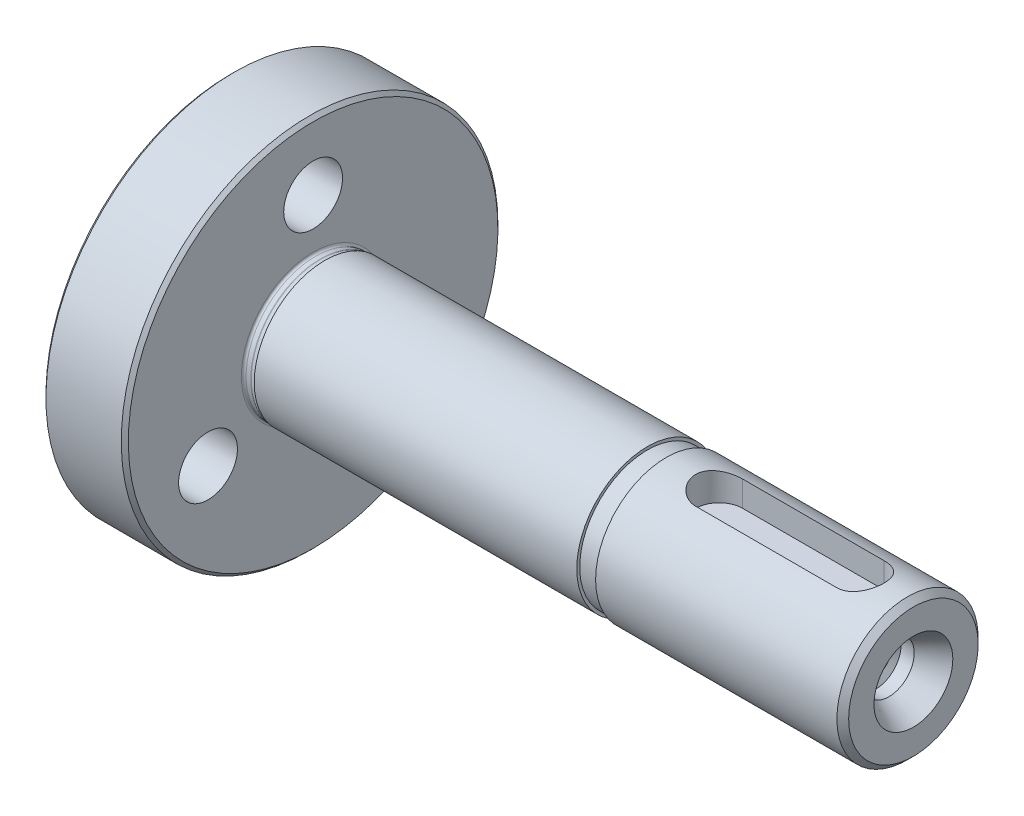
ISO-10303-21;
HEADER;
FILE_DESCRIPTION(('STEP AP214'),'2;1');
FILE_NAME('part.step','',(''),(''),'','','');
FILE_SCHEMA(('AUTOMOTIVE_DESIGN { 1 0 10303 214 1 1 1 1 }'));
ENDSEC;
DATA;
#1=APPLICATION_CONTEXT('core data for automotive mechanical design processes');
#2=APPLICATION_PROTOCOL_DEFINITION('international standard','automotive_design',2000,#1);
#3=PRODUCT_CONTEXT('',#1,'mechanical');
#4=PRODUCT('Part','Part','',(#3));
#5=PRODUCT_RELATED_PRODUCT_CATEGORY('part','',(#4));
#6=PRODUCT_DEFINITION_FORMATION('','',#4);
#7=PRODUCT_DEFINITION_CONTEXT('part definition',#1,'design');
#8=PRODUCT_DEFINITION('design','',#6,#7);
#9=PRODUCT_DEFINITION_SHAPE('','',#8);
#10=(LENGTH_UNIT() NAMED_UNIT(*) SI_UNIT(.MILLI.,.METRE.));
#11=(NAMED_UNIT(*) PLANE_ANGLE_UNIT() SI_UNIT($,.RADIAN.));
#12=(NAMED_UNIT(*) SI_UNIT($,.STERADIAN.) SOLID_ANGLE_UNIT());
#13=UNCERTAINTY_MEASURE_WITH_UNIT(LENGTH_MEASURE(1.E-05),#10,'distance_accuracy_value','');
#14=(GEOMETRIC_REPRESENTATION_CONTEXT(3) GLOBAL_UNCERTAINTY_ASSIGNED_CONTEXT((#13)) GLOBAL_UNIT_ASSIGNED_CONTEXT((#10,
#11,#12)) REPRESENTATION_CONTEXT('',''));
#15=CARTESIAN_POINT('',(0.,0.,0.));
#16=DIRECTION('',(0.,0.,1.));
#17=DIRECTION('',(1.,0.,0.));
#18=AXIS2_PLACEMENT_3D('',#15,#16,#17);
#19=CARTESIAN_POINT('',(37.0000000000346,0.,0.));
#20=DIRECTION('',(1.,0.,0.));
#21=DIRECTION('',(0.,0.,-1.));
#22=AXIS2_PLACEMENT_3D('',#19,#20,#21);
#23=CONICAL_SURFACE('',#22,1.64999999998372,1.02974425869627);
#24=CARTESIAN_POINT('',(36.0085799786987,0.,1.70530256582424E-10));
#25=VERTEX_POINT('',#24);
#26=VERTEX_LOOP('',#25);
#27=FACE_BOUND('',#26,.T.);
#28=CARTESIAN_POINT('',(37.,0.,0.));
#29=DIRECTION('',(1.,0.,0.));
#30=DIRECTION('',(0.,0.,-1.));
#31=AXIS2_PLACEMENT_3D('',#28,#29,#30);
#32=CIRCLE('',#31,1.65);
#33=CARTESIAN_POINT('',(37.,0.,-1.65));
#34=VERTEX_POINT('',#33);
#35=EDGE_CURVE('P0_E70',#34,#34,#32,.T.);
#36=ORIENTED_EDGE('',*,*,#35,.T.);
#37=EDGE_LOOP('',(#36));
#38=FACE_BOUND('',#37,.T.);
#39=ADVANCED_FACE('P0_F17',(#27,#38),#23,.F.);
#40=CARTESIAN_POINT('',(35.25900897753,0.,0.));
#41=DIRECTION('',(1.,0.,0.));
#42=DIRECTION('',(0.,0.,-1.));
#43=AXIS2_PLACEMENT_3D('',#40,#41,#42);
#44=CYLINDRICAL_SURFACE('',#43,1.65);
#45=ORIENTED_EDGE('',*,*,#35,.F.);
#46=EDGE_LOOP('',(#45));
#47=FACE_BOUND('',#46,.T.);
#48=CARTESIAN_POINT('',(47.4995696904443,0.,0.));
#49=DIRECTION('',(1.,0.,0.));
#50=DIRECTION('',(0.,0.,-1.));
#51=AXIS2_PLACEMENT_3D('',#48,#49,#50);
#52=CIRCLE('',#51,1.64999999992688);
#53=CARTESIAN_POINT('',(47.4995696904443,0.,-1.64999999992688));
#54=VERTEX_POINT('',#53);
#55=EDGE_CURVE('P0_E72',#54,#54,#52,.T.);
#56=ORIENTED_EDGE('',*,*,#55,.T.);
#57=EDGE_LOOP('',(#56));
#58=FACE_BOUND('',#57,.T.);
#59=ADVANCED_FACE('P0_F66',(#47,#58),#44,.F.);
#60=CARTESIAN_POINT('',(47.7999999998815,0.,0.));
#61=DIRECTION('',(1.,0.,0.));
#62=DIRECTION('',(0.,0.,-1.));
#63=AXIS2_PLACEMENT_3D('',#60,#61,#62);
#64=CONICAL_SURFACE('',#63,2.14999999974452,1.02974425864509);
#65=ORIENTED_EDGE('',*,*,#55,.F.);
#66=EDGE_LOOP('',(#65));
#67=FACE_BOUND('',#66,.T.);
#68=CARTESIAN_POINT('',(47.8,0.,0.));
#69=DIRECTION('',(1.,0.,0.));
#70=DIRECTION('',(0.,0.,-1.));
#71=AXIS2_PLACEMENT_3D('',#68,#69,#70);
#72=CIRCLE('',#71,2.15);
#73=CARTESIAN_POINT('',(47.8,0.,-2.15));
#74=VERTEX_POINT('',#73);
#75=EDGE_CURVE('P0_E75',#74,#74,#72,.T.);
#76=ORIENTED_EDGE('',*,*,#75,.T.);
#77=EDGE_LOOP('',(#76));
#78=FACE_BOUND('',#77,.T.);
#79=ADVANCED_FACE('P0_F283',(#67,#78),#64,.F.);
#80=CARTESIAN_POINT('',(46.28355715255,0.,0.));
#81=DIRECTION('',(1.,0.,0.));
#82=DIRECTION('',(0.,0.,-1.));
#83=AXIS2_PLACEMENT_3D('',#80,#81,#82);
#84=CYLINDRICAL_SURFACE('',#83,2.15);
#85=ORIENTED_EDGE('',*,*,#75,.F.);
#86=EDGE_LOOP('',(#85));
#87=FACE_BOUND('',#86,.T.);
#88=CARTESIAN_POINT('',(48.9215390309141,0.,0.));
#89=DIRECTION('',(1.,0.,0.));
#90=DIRECTION('',(0.,0.,-1.));
#91=AXIS2_PLACEMENT_3D('',#88,#89,#90);
#92=CIRCLE('',#91,2.15000000002874);
#93=CARTESIAN_POINT('',(48.9215390309141,0.,-2.15000000002874));
#94=VERTEX_POINT('',#93);
#95=EDGE_CURVE('P0_E278',#94,#94,#92,.T.);
#96=ORIENTED_EDGE('',*,*,#95,.T.);
#97=EDGE_LOOP('',(#96));
#98=FACE_BOUND('',#97,.T.);
#99=ADVANCED_FACE('P0_F285',(#87,#98),#84,.F.);
#100=CARTESIAN_POINT('',(51.0000000000446,0.,0.));
#101=DIRECTION('',(1.,0.,0.));
#102=DIRECTION('',(0.,0.,-1.));
#103=AXIS2_PLACEMENT_3D('',#100,#101,#102);
#104=CONICAL_SURFACE('',#103,3.35000000006858,0.523598775602716);
#105=ORIENTED_EDGE('',*,*,#95,.F.);
#106=EDGE_LOOP('',(#105));
#107=FACE_BOUND('',#106,.T.);
#108=CARTESIAN_POINT('',(50.9999999999877,0.,0.));
#109=DIRECTION('',(1.,0.,0.));
#110=DIRECTION('',(0.,0.,-1.));
#111=AXIS2_PLACEMENT_3D('',#108,#109,#110);
#112=CIRCLE('',#111,3.35000000003576);
#113=CARTESIAN_POINT('',(50.9999999999877,0.,-3.35000000003576));
#114=VERTEX_POINT('',#113);
#115=EDGE_CURVE('P0_E21',#114,#114,#112,.F.);
#116=ORIENTED_EDGE('',*,*,#115,.F.);
#117=EDGE_LOOP('',(#116));
#118=FACE_BOUND('',#117,.T.);
#119=ADVANCED_FACE('P0_F288',(#107,#118),#104,.F.);
#120=CARTESIAN_POINT('',(0.,3.5,0.));
#121=DIRECTION('',(0.,1.,0.));
#122=DIRECTION('',(0.,0.,1.));
#123=AXIS2_PLACEMENT_3D('',#120,#121,#122);
#124=PLANE('',#123);
#125=DIRECTION('',(1.,0.,0.));
#126=VECTOR('',#125,1.);
#127=CARTESIAN_POINT('',(34.5,3.5,2.));
#128=LINE('',#127,#126);
#129=CARTESIAN_POINT('',(34.5,3.5,2.));
#130=VERTEX_POINT('',#129);
#131=CARTESIAN_POINT('',(46.5,3.5,2.));
#132=VERTEX_POINT('',#131);
#133=EDGE_CURVE('P0_E58',#130,#132,#128,.T.);
#134=ORIENTED_EDGE('',*,*,#133,.T.);
#135=CARTESIAN_POINT('',(46.5,3.5,0.));
#136=DIRECTION('',(0.,1.,0.));
#137=DIRECTION('',(0.,0.,1.));
#138=AXIS2_PLACEMENT_3D('',#135,#136,#137);
#139=CIRCLE('',#138,2.);
#140=CARTESIAN_POINT('',(46.5,3.5,-2.));
#141=VERTEX_POINT('',#140);
#142=EDGE_CURVE('P0_E60',#132,#141,#139,.T.);
#143=ORIENTED_EDGE('',*,*,#142,.T.);
#144=DIRECTION('',(-1.,0.,0.));
#145=VECTOR('',#144,1.);
#146=CARTESIAN_POINT('',(46.5,3.5,-2.));
#147=LINE('',#146,#145);
#148=CARTESIAN_POINT('',(34.5,3.5,-2.));
#149=VERTEX_POINT('',#148);
#150=EDGE_CURVE('P0_E276',#141,#149,#147,.T.);
#151=ORIENTED_EDGE('',*,*,#150,.T.);
#152=CARTESIAN_POINT('',(34.5,3.5,0.));
#153=DIRECTION('',(0.,1.,0.));
#154=DIRECTION('',(0.,0.,1.));
#155=AXIS2_PLACEMENT_3D('',#152,#153,#154);
#156=CIRCLE('',#155,2.);
#157=EDGE_CURVE('P0_E267',#149,#130,#156,.T.);
#158=ORIENTED_EDGE('',*,*,#157,.T.);
#159=EDGE_LOOP('',(#134,#143,#151,#158));
#160=FACE_BOUND('',#159,.T.);
#161=ADVANCED_FACE('P0_F294',(#160),#124,.T.);
#162=CARTESIAN_POINT('',(51.,0.,0.));
#163=DIRECTION('',(1.,0.,0.));
#164=DIRECTION('',(0.,0.,-1.));
#165=AXIS2_PLACEMENT_3D('',#162,#163,#164);
#166=PLANE('',#165);
#167=CARTESIAN_POINT('',(50.9999999999877,0.,0.));
#168=DIRECTION('',(-1.,0.,0.));
#169=DIRECTION('',(0.,0.,1.));
#170=AXIS2_PLACEMENT_3D('',#167,#168,#169);
#171=CIRCLE('',#170,5.49999999998363);
#172=CARTESIAN_POINT('',(50.9999999999877,0.,5.49999999998363));
#173=VERTEX_POINT('',#172);
#174=EDGE_CURVE('P0_E263',#173,#173,#171,.T.);
#175=ORIENTED_EDGE('',*,*,#174,.F.);
#176=EDGE_LOOP('',(#175));
#177=FACE_BOUND('',#176,.T.);
#178=ORIENTED_EDGE('',*,*,#115,.T.);
#179=EDGE_LOOP('',(#178));
#180=FACE_BOUND('',#179,.T.);
#181=ADVANCED_FACE('P0_F299',(#177,#180),#166,.T.);
#182=CARTESIAN_POINT('',(46.5,6.1,-2.));
#183=DIRECTION('',(0.,0.,-1.));
#184=DIRECTION('',(-1.,0.,0.));
#185=AXIS2_PLACEMENT_3D('',#182,#183,#184);
#186=PLANE('',#185);
#187=DIRECTION('',(-1.,0.,0.));
#188=VECTOR('',#187,1.);
#189=CARTESIAN_POINT('',(131.4378642203,5.65685424949236,-2.00000000000006));
#190=LINE('',#189,#188);
#191=CARTESIAN_POINT('',(34.5,5.65685424949237,-2.00000000000003));
#192=VERTEX_POINT('',#191);
#193=CARTESIAN_POINT('',(46.5,5.65685424949237,-2.00000000000001));
#194=VERTEX_POINT('',#193);
#195=EDGE_CURVE('P0_E258',#192,#194,#190,.F.);
#196=ORIENTED_EDGE('',*,*,#195,.F.);
#197=DIRECTION('',(0.,1.,0.));
#198=VECTOR('',#197,1.);
#199=CARTESIAN_POINT('',(34.5,6.1,-2.));
#200=LINE('',#199,#198);
#201=EDGE_CURVE('P0_E268',#192,#149,#200,.F.);
#202=ORIENTED_EDGE('',*,*,#201,.T.);
#203=ORIENTED_EDGE('',*,*,#150,.F.);
#204=DIRECTION('',(0.,1.,0.));
#205=VECTOR('',#204,1.);
#206=CARTESIAN_POINT('',(46.5,6.1,-2.));
#207=LINE('',#206,#205);
#208=EDGE_CURVE('P0_E273',#141,#194,#207,.T.);
#209=ORIENTED_EDGE('',*,*,#208,.T.);
#210=EDGE_LOOP('',(#196,#202,#203,#209));
#211=FACE_BOUND('',#210,.T.);
#212=ADVANCED_FACE('P0_F301',(#211),#186,.F.);
#213=CARTESIAN_POINT('',(46.5,6.1,0.));
#214=DIRECTION('',(0.,1.,0.));
#215=DIRECTION('',(0.,0.,1.));
#216=AXIS2_PLACEMENT_3D('',#213,#214,#215);
#217=CYLINDRICAL_SURFACE('',#216,2.);
#218=ORIENTED_EDGE('',*,*,#208,.F.);
#219=ORIENTED_EDGE('',*,*,#142,.F.);
#220=DIRECTION('',(0.,1.,0.));
#221=VECTOR('',#220,1.);
#222=CARTESIAN_POINT('',(46.5,6.1,2.));
#223=LINE('',#222,#221);
#224=CARTESIAN_POINT('',(46.5,5.65685424949237,2.00000000000003));
#225=VERTEX_POINT('',#224);
#226=EDGE_CURVE('P0_E271',#132,#225,#223,.T.);
#227=ORIENTED_EDGE('',*,*,#226,.T.);
#228=CARTESIAN_POINT('',(46.5,5.65685424949238,-2.));
#229=CARTESIAN_POINT('',(46.5545809936022,5.65684884188678,-2.0000014949184));
#230=CARTESIAN_POINT('',(46.6091341243787,5.6576451988649,-1.99776424917478));
#231=CARTESIAN_POINT('',(46.7178171681098,5.66078654578442,-1.9888512140728));
#232=CARTESIAN_POINT('',(46.7719471913194,5.66313111768244,-1.98217662286705));
#233=CARTESIAN_POINT('',(46.9327842863903,5.67238184449301,-1.95562135046158));
#234=CARTESIAN_POINT('',(47.038361692541,5.6815058499903,-1.92920846605623));
#235=CARTESIAN_POINT('',(47.2432503848876,5.70456149397718,-1.85991682366086));
#236=CARTESIAN_POINT('',(47.3425650937458,5.71849047905858,-1.81704715197507));
#237=CARTESIAN_POINT('',(47.5326796680109,5.74957574438921,-1.71614645792974));
#238=CARTESIAN_POINT('',(47.6234742581347,5.76673400456216,-1.65810612564547));
#239=CARTESIAN_POINT('',(47.7974404626491,5.80308960804095,-1.52610278704603));
#240=CARTESIAN_POINT('',(47.8802297609252,5.82233755536618,-1.45164996064408));
#241=CARTESIAN_POINT('',(48.0324120355834,5.86027697385956,-1.28997688598297));
#242=CARTESIAN_POINT('',(48.1018026265119,5.87896834543705,-1.20275436910908));
#243=CARTESIAN_POINT('',(48.2269590376084,5.91427765988454,-1.01520729191253));
#244=CARTESIAN_POINT('',(48.2823219688045,5.93082875123708,-0.914600178716998));
#245=CARTESIAN_POINT('',(48.3751845033745,5.95939217209316,-0.704858499931723));
#246=CARTESIAN_POINT('',(48.4126895636409,5.97140588786619,-0.595726551186845));
#247=CARTESIAN_POINT('',(48.4674714521827,5.98918142285845,-0.376058690956079));
#248=CARTESIAN_POINT('',(48.4854065451074,5.99514617977147,-0.265703668920229));
#249=CARTESIAN_POINT('',(48.5026325970512,6.00087216807634,-0.04339793891135));
#250=CARTESIAN_POINT('',(48.5019279985395,6.00063487762605,0.0685523824907814));
#251=CARTESIAN_POINT('',(48.4823114337867,5.99412077270532,0.286207690558781));
#252=CARTESIAN_POINT('',(48.4641147240811,5.98808121982527,0.391985405251069));
#253=CARTESIAN_POINT('',(48.4112136026518,5.97093921001647,0.598888128753308));
#254=CARTESIAN_POINT('',(48.3765082755875,5.95983647235462,0.700012879232924));
#255=CARTESIAN_POINT('',(48.2911572607987,5.93351336542608,0.896305246061921));
#256=CARTESIAN_POINT('',(48.2403079097553,5.91824075676625,0.991377011307981));
#257=CARTESIAN_POINT('',(48.1242800972186,5.88516775360088,1.17184917819497));
#258=CARTESIAN_POINT('',(48.059097737907,5.86736667195186,1.25724693942937));
#259=CARTESIAN_POINT('',(47.9126579000063,5.83012543885479,1.42019467942242));
#260=CARTESIAN_POINT('',(47.8307889127806,5.81064757359828,1.49718722322539));
#261=CARTESIAN_POINT('',(47.6551170205677,5.77294980945702,1.63654404964076));
#262=CARTESIAN_POINT('',(47.5613102751935,5.75473031831506,1.69890360636762));
#263=CARTESIAN_POINT('',(47.3626396432934,5.72140062752635,1.80800665118557));
#264=CARTESIAN_POINT('',(47.2576329701341,5.70634029896469,1.85450601901537));
#265=CARTESIAN_POINT('',(47.0407060448201,5.68162194124078,1.92892046140223));
#266=CARTESIAN_POINT('',(46.9287970132557,5.67195538817985,1.95686487211071));
#267=CARTESIAN_POINT('',(46.763162726504,5.6627308418944,1.98331631256166));
#268=CARTESIAN_POINT('',(46.7107172202915,5.66053335389204,1.98957012251023));
#269=CARTESIAN_POINT('',(46.6055238432004,5.65759407142798,1.99790923214239));
#270=CARTESIAN_POINT('',(46.5527764509112,5.65685039859056,1.99999991078996));
#271=CARTESIAN_POINT('',(46.5,5.65685424949238,2.));
#272=B_SPLINE_CURVE_WITH_KNOTS('',3,(#228,#229,#230,#231,#232,#233,#234,#235,#236,#237,#238,
#239,#240,#241,#242,#243,#244,#245,#246,#247,#248,#249,#250,#251,#252,#253,#254,#255,#256,#257,
#258,#259,#260,#261,#262,#263,#264,#265,#266,#267,#268,#269,#270,#271),.UNSPECIFIED.,.F.,.F.,(4,
2,2,2,2,2,2,2,2,2,2,2,2,2,2,2,2,2,2,2,2,4),(0.,0.163636969470867,0.327229772338919,
0.653162396790742,0.978915321932481,1.30486862627062,1.64233009925355,1.97985159727494,
2.32618265866202,2.67240782242254,3.00658941454805,3.34069136061284,3.6616883693147,
3.98270317816496,4.30794037651935,4.63326613177537,4.973881081161,5.31460588498484,
5.6603605985608,6.00556734973678,6.16399790665502,6.32222363058113),.UNSPECIFIED.);
#273=EDGE_CURVE('P0_E134',#194,#225,#272,.T.);
#274=ORIENTED_EDGE('',*,*,#273,.F.);
#275=EDGE_LOOP('',(#218,#219,#227,#274));
#276=FACE_BOUND('',#275,.T.);
#277=ADVANCED_FACE('P0_F308',(#276),#217,.F.);
#278=CARTESIAN_POINT('',(34.5,6.1,2.));
#279=DIRECTION('',(0.,0.,1.));
#280=DIRECTION('',(1.,0.,0.));
#281=AXIS2_PLACEMENT_3D('',#278,#279,#280);
#282=PLANE('',#281);
#283=ORIENTED_EDGE('',*,*,#133,.F.);
#284=DIRECTION('',(0.,1.,0.));
#285=VECTOR('',#284,1.);
#286=CARTESIAN_POINT('',(34.5,6.1,2.));
#287=LINE('',#286,#285);
#288=CARTESIAN_POINT('',(34.5,5.65685424949237,2.00000000000001));
#289=VERTEX_POINT('',#288);
#290=EDGE_CURVE('P0_E36',#130,#289,#287,.T.);
#291=ORIENTED_EDGE('',*,*,#290,.T.);
#292=DIRECTION('',(-1.,0.,0.));
#293=VECTOR('',#292,1.);
#294=CARTESIAN_POINT('',(131.4378642203,5.65685424949236,2.00000000000006));
#295=LINE('',#294,#293);
#296=EDGE_CURVE('P0_E133',#225,#289,#295,.T.);
#297=ORIENTED_EDGE('',*,*,#296,.F.);
#298=ORIENTED_EDGE('',*,*,#226,.F.);
#299=EDGE_LOOP('',(#283,#291,#297,#298));
#300=FACE_BOUND('',#299,.T.);
#301=ADVANCED_FACE('P0_F159',(#300),#282,.F.);
#302=CARTESIAN_POINT('',(34.5,6.1,0.));
#303=DIRECTION('',(0.,1.,0.));
#304=DIRECTION('',(0.,0.,1.));
#305=AXIS2_PLACEMENT_3D('',#302,#303,#304);
#306=CYLINDRICAL_SURFACE('',#305,2.);
#307=ORIENTED_EDGE('',*,*,#290,.F.);
#308=ORIENTED_EDGE('',*,*,#157,.F.);
#309=ORIENTED_EDGE('',*,*,#201,.F.);
#310=CARTESIAN_POINT('',(34.5,5.65685424949238,2.));
#311=CARTESIAN_POINT('',(34.4454190063978,5.65684884188678,2.0000014949184));
#312=CARTESIAN_POINT('',(34.3908658756213,5.6576451988649,1.99776424917478));
#313=CARTESIAN_POINT('',(34.2821828318902,5.66078654578442,1.9888512140728));
#314=CARTESIAN_POINT('',(34.2280528086806,5.66313111768244,1.98217662286705));
#315=CARTESIAN_POINT('',(34.0672157136097,5.67238184449301,1.95562135046158));
#316=CARTESIAN_POINT('',(33.961638307459,5.6815058499903,1.92920846605623));
#317=CARTESIAN_POINT('',(33.7567496151124,5.70456149397718,1.85991682366086));
#318=CARTESIAN_POINT('',(33.6574349062542,5.71849047905858,1.81704715197507));
#319=CARTESIAN_POINT('',(33.4673203319891,5.74957574438921,1.71614645792974));
#320=CARTESIAN_POINT('',(33.3765257418653,5.76673400456216,1.65810612564547));
#321=CARTESIAN_POINT('',(33.2025595373509,5.80308960804095,1.52610278704603));
#322=CARTESIAN_POINT('',(33.1197702390748,5.82233755536618,1.45164996064408));
#323=CARTESIAN_POINT('',(32.9675879644166,5.86027697385956,1.28997688598297));
#324=CARTESIAN_POINT('',(32.8981973734881,5.87896834543705,1.20275436910908));
#325=CARTESIAN_POINT('',(32.7730409623916,5.91427765988454,1.01520729191253));
#326=CARTESIAN_POINT('',(32.7176780311955,5.93082875123708,0.914600178716998));
#327=CARTESIAN_POINT('',(32.6248154966255,5.95939217209316,0.704858499931723));
#328=CARTESIAN_POINT('',(32.5873104363591,5.97140588786619,0.595726551186845));
#329=CARTESIAN_POINT('',(32.5325285478173,5.98918142285845,0.376058690956079));
#330=CARTESIAN_POINT('',(32.5145934548926,5.99514617977147,0.265703668920229));
#331=CARTESIAN_POINT('',(32.4973674029488,6.00087216807634,0.04339793891135));
#332=CARTESIAN_POINT('',(32.4980720014605,6.00063487762605,-0.0685523824907814));
#333=CARTESIAN_POINT('',(32.5176885662133,5.99412077270532,-0.286207690558781));
#334=CARTESIAN_POINT('',(32.5358852759189,5.98808121982527,-0.391985405251069));
#335=CARTESIAN_POINT('',(32.5887863973482,5.97093921001647,-0.598888128753308));
#336=CARTESIAN_POINT('',(32.6234917244125,5.95983647235462,-0.700012879232924));
#337=CARTESIAN_POINT('',(32.7088427392013,5.93351336542608,-0.896305246061921));
#338=CARTESIAN_POINT('',(32.7596920902447,5.91824075676625,-0.991377011307981));
#339=CARTESIAN_POINT('',(32.8757199027814,5.88516775360088,-1.17184917819497));
#340=CARTESIAN_POINT('',(32.940902262093,5.86736667195186,-1.25724693942937));
#341=CARTESIAN_POINT('',(33.0873420999937,5.83012543885479,-1.42019467942242));
#342=CARTESIAN_POINT('',(33.1692110872194,5.81064757359828,-1.49718722322539));
#343=CARTESIAN_POINT('',(33.3448829794323,5.77294980945702,-1.63654404964076));
#344=CARTESIAN_POINT('',(33.4386897248065,5.75473031831506,-1.69890360636762));
#345=CARTESIAN_POINT('',(33.6373603567066,5.72140062752635,-1.80800665118557));
#346=CARTESIAN_POINT('',(33.7423670298659,5.70634029896469,-1.85450601901537));
#347=CARTESIAN_POINT('',(33.9592939551799,5.68162194124078,-1.92892046140223));
#348=CARTESIAN_POINT('',(34.0712029867443,5.67195538817985,-1.95686487211071));
#349=CARTESIAN_POINT('',(34.236837273496,5.6627308418944,-1.98331631256166));
#350=CARTESIAN_POINT('',(34.2892827797085,5.66053335389204,-1.98957012251023));
#351=CARTESIAN_POINT('',(34.3944761567996,5.65759407142798,-1.99790923214239));
#352=CARTESIAN_POINT('',(34.4472235490888,5.65685039859056,-1.99999991078996));
#353=CARTESIAN_POINT('',(34.5,5.65685424949238,-2.));
#354=B_SPLINE_CURVE_WITH_KNOTS('',3,(#310,#311,#312,#313,#314,#315,#316,#317,#318,#319,#320,
#321,#322,#323,#324,#325,#326,#327,#328,#329,#330,#331,#332,#333,#334,#335,#336,#337,#338,#339,
#340,#341,#342,#343,#344,#345,#346,#347,#348,#349,#350,#351,#352,#353),.UNSPECIFIED.,.F.,.F.,(4,
2,2,2,2,2,2,2,2,2,2,2,2,2,2,2,2,2,2,2,2,4),(0.,0.163636969470867,0.327229772338919,
0.653162396790742,0.978915321932481,1.30486862627062,1.64233009925355,1.97985159727494,
2.32618265866202,2.67240782242254,3.00658941454805,3.34069136061284,3.6616883693147,
3.98270317816496,4.30794037651935,4.63326613177537,4.973881081161,5.31460588498484,
5.6603605985608,6.00556734973678,6.16399790665502,6.32222363058113),.UNSPECIFIED.);
#355=EDGE_CURVE('P0_E125',#289,#192,#354,.T.);
#356=ORIENTED_EDGE('',*,*,#355,.F.);
#357=EDGE_LOOP('',(#307,#308,#309,#356));
#358=FACE_BOUND('',#357,.T.);
#359=ADVANCED_FACE('P0_F140',(#358),#306,.F.);
#360=CARTESIAN_POINT('',(50.5000000000564,0.,0.));
#361=DIRECTION('',(-1.,0.,0.));
#362=DIRECTION('',(0.,0.,1.));
#363=AXIS2_PLACEMENT_3D('',#360,#361,#362);
#364=CONICAL_SURFACE('',#363,5.99999999997181,0.785398163454292);
#365=ORIENTED_EDGE('',*,*,#174,.T.);
#366=EDGE_LOOP('',(#365));
#367=FACE_BOUND('',#366,.T.);
#368=CARTESIAN_POINT('',(50.5,0.,0.));
#369=DIRECTION('',(-1.,0.,0.));
#370=DIRECTION('',(0.,0.,1.));
#371=AXIS2_PLACEMENT_3D('',#368,#369,#370);
#372=CIRCLE('',#371,6.);
#373=CARTESIAN_POINT('',(50.5,0.,6.));
#374=VERTEX_POINT('',#373);
#375=EDGE_CURVE('P0_E124',#374,#374,#372,.T.);
#376=ORIENTED_EDGE('',*,*,#375,.F.);
#377=EDGE_LOOP('',(#376));
#378=FACE_BOUND('',#377,.T.);
#379=ADVANCED_FACE('P0_F149',(#367,#378),#364,.T.);
#380=CARTESIAN_POINT('',(131.4378642203,0.,0.));
#381=DIRECTION('',(-1.,0.,0.));
#382=DIRECTION('',(0.,0.,1.));
#383=AXIS2_PLACEMENT_3D('',#380,#381,#382);
#384=CYLINDRICAL_SURFACE('',#383,6.);
#385=ORIENTED_EDGE('',*,*,#375,.T.);
#386=EDGE_LOOP('',(#385));
#387=FACE_BOUND('',#386,.T.);
#388=CARTESIAN_POINT('',(30.,0.,0.));
#389=DIRECTION('',(-1.,0.,0.));
#390=DIRECTION('',(0.,0.,1.));
#391=AXIS2_PLACEMENT_3D('',#388,#389,#390);
#392=CIRCLE('',#391,6.);
#393=CARTESIAN_POINT('',(30.,0.,6.));
#394=VERTEX_POINT('',#393);
#395=EDGE_CURVE('P0_E121',#394,#394,#392,.F.);
#396=ORIENTED_EDGE('',*,*,#395,.T.);
#397=EDGE_LOOP('',(#396));
#398=FACE_BOUND('',#397,.T.);
#399=ORIENTED_EDGE('',*,*,#296,.T.);
#400=ORIENTED_EDGE('',*,*,#355,.T.);
#401=ORIENTED_EDGE('',*,*,#195,.T.);
#402=ORIENTED_EDGE('',*,*,#273,.T.);
#403=EDGE_LOOP('',(#399,#400,#401,#402));
#404=FACE_BOUND('',#403,.T.);
#405=ADVANCED_FACE('P0_F144',(#387,#398,#404),#384,.T.);
#406=CARTESIAN_POINT('',(30.,0.,0.));
#407=DIRECTION('',(1.,0.,0.));
#408=DIRECTION('',(0.,0.,-1.));
#409=AXIS2_PLACEMENT_3D('',#406,#407,#408);
#410=PLANE('',#409);
#411=ORIENTED_EDGE('',*,*,#395,.F.);
#412=EDGE_LOOP('',(#411));
#413=FACE_BOUND('',#412,.T.);
#414=CARTESIAN_POINT('',(30.,0.,0.));
#415=DIRECTION('',(1.,0.,0.));
#416=DIRECTION('',(0.,0.,-1.));
#417=AXIS2_PLACEMENT_3D('',#414,#415,#416);
#418=CIRCLE('',#417,5.75);
#419=CARTESIAN_POINT('',(30.,0.,-5.75));
#420=VERTEX_POINT('',#419);
#421=EDGE_CURVE('P0_E118',#420,#420,#418,.F.);
#422=ORIENTED_EDGE('',*,*,#421,.F.);
#423=EDGE_LOOP('',(#422));
#424=FACE_BOUND('',#423,.T.);
#425=ADVANCED_FACE('P0_F148',(#413,#424),#410,.F.);
#426=CARTESIAN_POINT('',(-9.9,0.,0.));
#427=DIRECTION('',(1.,0.,0.));
#428=DIRECTION('',(0.,0.,-1.));
#429=AXIS2_PLACEMENT_3D('',#426,#427,#428);
#430=CYLINDRICAL_SURFACE('',#429,5.75);
#431=ORIENTED_EDGE('',*,*,#421,.T.);
#432=EDGE_LOOP('',(#431));
#433=FACE_BOUND('',#432,.T.);
#434=CARTESIAN_POINT('',(28.4,0.,0.));
#435=DIRECTION('',(1.,0.,0.));
#436=DIRECTION('',(0.,0.,-1.));
#437=AXIS2_PLACEMENT_3D('',#434,#435,#436);
#438=CIRCLE('',#437,5.75);
#439=CARTESIAN_POINT('',(28.4,0.,-5.75));
#440=VERTEX_POINT('',#439);
#441=EDGE_CURVE('P0_E115',#440,#440,#438,.F.);
#442=ORIENTED_EDGE('',*,*,#441,.F.);
#443=EDGE_LOOP('',(#442));
#444=FACE_BOUND('',#443,.T.);
#445=ADVANCED_FACE('P0_F234',(#433,#444),#430,.T.);
#446=CARTESIAN_POINT('',(28.4,0.,0.));
#447=DIRECTION('',(1.,0.,0.));
#448=DIRECTION('',(0.,0.,-1.));
#449=AXIS2_PLACEMENT_3D('',#446,#447,#448);
#450=PLANE('',#449);
#451=CARTESIAN_POINT('',(28.4,0.,0.));
#452=DIRECTION('',(-1.,0.,0.));
#453=DIRECTION('',(0.,0.,1.));
#454=AXIS2_PLACEMENT_3D('',#451,#452,#453);
#455=CIRCLE('',#454,6.);
#456=CARTESIAN_POINT('',(28.4,0.,6.));
#457=VERTEX_POINT('',#456);
#458=EDGE_CURVE('P0_E112',#457,#457,#455,.T.);
#459=ORIENTED_EDGE('',*,*,#458,.F.);
#460=EDGE_LOOP('',(#459));
#461=FACE_BOUND('',#460,.T.);
#462=ORIENTED_EDGE('',*,*,#441,.T.);
#463=EDGE_LOOP('',(#462));
#464=FACE_BOUND('',#463,.T.);
#465=ADVANCED_FACE('P0_F231',(#461,#464),#450,.T.);
#466=CARTESIAN_POINT('',(-6.,0.,0.));
#467=DIRECTION('',(1.,0.,0.));
#468=DIRECTION('',(0.,0.,-1.));
#469=AXIS2_PLACEMENT_3D('',#466,#467,#468);
#470=PLANE('',#469);
#471=CARTESIAN_POINT('',(-6.00000000002865,0.,0.));
#472=DIRECTION('',(-1.,0.,0.));
#473=DIRECTION('',(0.,0.,1.));
#474=AXIS2_PLACEMENT_3D('',#471,#472,#473);
#475=CIRCLE('',#474,6.35000000000643);
#476=CARTESIAN_POINT('',(-6.00000000002865,0.,6.35000000000643));
#477=VERTEX_POINT('',#476);
#478=EDGE_CURVE('P0_E109',#477,#477,#475,.T.);
#479=ORIENTED_EDGE('',*,*,#478,.T.);
#480=EDGE_LOOP('',(#479));
#481=FACE_BOUND('',#480,.T.);
#482=ADVANCED_FACE('P0_F227',(#481),#470,.F.);
#483=CARTESIAN_POINT('',(131.4378642203,0.,0.));
#484=DIRECTION('',(-1.,0.,0.));
#485=DIRECTION('',(0.,0.,1.));
#486=AXIS2_PLACEMENT_3D('',#483,#484,#485);
#487=CYLINDRICAL_SURFACE('',#486,6.);
#488=ORIENTED_EDGE('',*,*,#458,.T.);
#489=EDGE_LOOP('',(#488));
#490=FACE_BOUND('',#489,.T.);
#491=CARTESIAN_POINT('',(0.996794919217336,0.,0.));
#492=DIRECTION('',(1.,0.,0.));
#493=DIRECTION('',(0.,0.,-1.));
#494=AXIS2_PLACEMENT_3D('',#491,#492,#493);
#495=CIRCLE('',#494,6.00000000000023);
#496=CARTESIAN_POINT('',(0.996794919217336,0.,-6.00000000000023));
#497=VERTEX_POINT('',#496);
#498=EDGE_CURVE('P0_E108',#497,#497,#495,.F.);
#499=ORIENTED_EDGE('',*,*,#498,.F.);
#500=EDGE_LOOP('',(#499));
#501=FACE_BOUND('',#500,.T.);
#502=ADVANCED_FACE('P0_F223',(#490,#501),#487,.T.);
#503=CARTESIAN_POINT('',(-6.99999999989132,0.,0.));
#504=DIRECTION('',(-1.,0.,0.));
#505=DIRECTION('',(0.,0.,1.));
#506=AXIS2_PLACEMENT_3D('',#503,#504,#505);
#507=CONICAL_SURFACE('',#506,6.92735026910896,0.523598775592442);
#508=ORIENTED_EDGE('',*,*,#478,.F.);
#509=EDGE_LOOP('',(#508));
#510=FACE_BOUND('',#509,.T.);
#511=CARTESIAN_POINT('',(-7.000000000005,0.,0.));
#512=DIRECTION('',(-1.,0.,0.));
#513=DIRECTION('',(0.,0.,1.));
#514=AXIS2_PLACEMENT_3D('',#511,#512,#513);
#515=CIRCLE('',#514,6.92735026917459);
#516=CARTESIAN_POINT('',(-7.000000000005,0.,6.92735026917459));
#517=VERTEX_POINT('',#516);
#518=EDGE_CURVE('P0_E105',#517,#517,#515,.T.);
#519=ORIENTED_EDGE('',*,*,#518,.T.);
#520=EDGE_LOOP('',(#519));
#521=FACE_BOUND('',#520,.T.);
#522=ADVANCED_FACE('P0_F219',(#510,#521),#507,.F.);
#523=CARTESIAN_POINT('',(0.99679491910365,0.,0.));
#524=DIRECTION('',(1.,0.,0.));
#525=DIRECTION('',(0.,0.,-1.));
#526=AXIS2_PLACEMENT_3D('',#523,#524,#525);
#527=CONICAL_SURFACE('',#526,5.99999999997181,0.261799387749815);
#528=CARTESIAN_POINT('',(0.649023147988954,0.,0.));
#529=DIRECTION('',(1.,0.,0.));
#530=DIRECTION('',(0.,0.,-1.));
#531=AXIS2_PLACEMENT_3D('',#528,#529,#530);
#532=CIRCLE('',#531,5.90681483474217);
#533=CARTESIAN_POINT('',(0.649023147988954,0.,-5.90681483474217));
#534=VERTEX_POINT('',#533);
#535=EDGE_CURVE('P0_E104',#534,#534,#532,.T.);
#536=ORIENTED_EDGE('',*,*,#535,.T.);
#537=EDGE_LOOP('',(#536));
#538=FACE_BOUND('',#537,.T.);
#539=ORIENTED_EDGE('',*,*,#498,.T.);
#540=EDGE_LOOP('',(#539));
#541=FACE_BOUND('',#540,.T.);
#542=ADVANCED_FACE('P0_F215',(#538,#541),#527,.T.);
#543=CARTESIAN_POINT('',(-7.,0.,0.));
#544=DIRECTION('',(1.,0.,0.));
#545=DIRECTION('',(0.,0.,-1.));
#546=AXIS2_PLACEMENT_3D('',#543,#544,#545);
#547=PLANE('',#546);
#548=CARTESIAN_POINT('',(-6.99999999999803,0.,0.));
#549=DIRECTION('',(1.,0.,0.));
#550=DIRECTION('',(0.,1.,0.));
#551=AXIS2_PLACEMENT_3D('',#548,#549,#550);
#552=CIRCLE('',#551,15.699999999998);
#553=CARTESIAN_POINT('',(-6.99999999999803,15.699999999998,0.));
#554=VERTEX_POINT('',#553);
#555=EDGE_CURVE('P0_E101',#554,#554,#552,.T.);
#556=ORIENTED_EDGE('',*,*,#555,.F.);
#557=EDGE_LOOP('',(#556));
#558=FACE_BOUND('',#557,.T.);
#559=ORIENTED_EDGE('',*,*,#518,.F.);
#560=EDGE_LOOP('',(#559));
#561=FACE_BOUND('',#560,.T.);
#562=CARTESIAN_POINT('',(-7.00000000006185,10.313,0.));
#563=DIRECTION('',(-1.,0.,0.));
#564=DIRECTION('',(0.,0.,1.));
#565=AXIS2_PLACEMENT_3D('',#562,#563,#564);
#566=CIRCLE('',#565,2.67320508072544);
#567=CARTESIAN_POINT('',(-7.00000000006185,10.313,2.67320508072544));
#568=VERTEX_POINT('',#567);
#569=EDGE_CURVE('P0_E91',#568,#568,#566,.F.);
#570=ORIENTED_EDGE('',*,*,#569,.T.);
#571=EDGE_LOOP('',(#570));
#572=FACE_BOUND('',#571,.T.);
#573=CARTESIAN_POINT('',(-7.000000000005,-5.1565,-8.931319989229));
#574=DIRECTION('',(-1.,0.,0.));
#575=DIRECTION('',(0.,0.,1.));
#576=AXIS2_PLACEMENT_3D('',#573,#574,#575);
#577=CIRCLE('',#576,2.67320508070998);
#578=CARTESIAN_POINT('',(-7.000000000005,-5.1565,-6.25811490851902));
#579=VERTEX_POINT('',#578);
#580=EDGE_CURVE('P0_E98',#579,#579,#577,.F.);
#581=ORIENTED_EDGE('',*,*,#580,.T.);
#582=EDGE_LOOP('',(#581));
#583=FACE_BOUND('',#582,.T.);
#584=CARTESIAN_POINT('',(-6.99999999994816,-5.1565,8.931319989229));
#585=DIRECTION('',(-1.,0.,0.));
#586=DIRECTION('',(0.,0.,1.));
#587=AXIS2_PLACEMENT_3D('',#584,#585,#586);
#588=CIRCLE('',#587,2.67320508074969);
#589=CARTESIAN_POINT('',(-6.99999999994816,-5.1565,11.6045250699787));
#590=VERTEX_POINT('',#589);
#591=EDGE_CURVE('P0_E95',#590,#590,#588,.F.);
#592=ORIENTED_EDGE('',*,*,#591,.T.);
#593=EDGE_LOOP('',(#592));
#594=FACE_BOUND('',#593,.T.);
#595=ADVANCED_FACE('P0_F212',(#558,#561,#572,#583,#594),#547,.F.);
#596=CARTESIAN_POINT('',(0.5972593389685,0.,0.));
#597=DIRECTION('',(1.,0.,0.));
#598=DIRECTION('',(0.,0.,-1.));
#599=AXIS2_PLACEMENT_3D('',#596,#597,#598);
#600=TOROIDAL_SURFACE('',#599,6.10000000000005,0.20000000000005);
#601=CARTESIAN_POINT('',(0.5972593389685,0.,0.));
#602=DIRECTION('',(1.,0.,0.));
#603=DIRECTION('',(0.,0.,-1.));
#604=AXIS2_PLACEMENT_3D('',#601,#602,#603);
#605=CIRCLE('',#604,5.9);
#606=CARTESIAN_POINT('',(0.5972593389685,0.,-5.9));
#607=VERTEX_POINT('',#606);
#608=EDGE_CURVE('P0_E94',#607,#607,#605,.F.);
#609=ORIENTED_EDGE('',*,*,#608,.F.);
#610=EDGE_LOOP('',(#609));
#611=FACE_BOUND('',#610,.T.);
#612=ORIENTED_EDGE('',*,*,#535,.F.);
#613=EDGE_LOOP('',(#612));
#614=FACE_BOUND('',#613,.T.);
#615=ADVANCED_FACE('P0_F210',(#611,#614),#600,.F.);
#616=CARTESIAN_POINT('',(-6.7,0.,0.));
#617=DIRECTION('',(1.,0.,0.));
#618=DIRECTION('',(0.,1.,0.));
#619=AXIS2_PLACEMENT_3D('',#616,#617,#618);
#620=CONICAL_SURFACE('',#619,15.999999999996,0.785398163397299);
#621=ORIENTED_EDGE('',*,*,#555,.T.);
#622=EDGE_LOOP('',(#621));
#623=FACE_BOUND('',#622,.T.);
#624=CARTESIAN_POINT('',(-6.7,0.,0.));
#625=DIRECTION('',(1.,0.,0.));
#626=DIRECTION('',(0.,0.,-1.));
#627=AXIS2_PLACEMENT_3D('',#624,#625,#626);
#628=CIRCLE('',#627,16.);
#629=CARTESIAN_POINT('',(-6.7,0.,-16.));
#630=VERTEX_POINT('',#629);
#631=EDGE_CURVE('P0_E329',#630,#630,#628,.T.);
#632=ORIENTED_EDGE('',*,*,#631,.F.);
#633=EDGE_LOOP('',(#632));
#634=FACE_BOUND('',#633,.T.);
#635=ADVANCED_FACE('P0_F206',(#623,#634),#620,.T.);
#636=CARTESIAN_POINT('',(-7.000000000005,-5.1565,-8.931319989229));
#637=DIRECTION('',(-1.,0.,0.));
#638=DIRECTION('',(0.,0.,1.));
#639=AXIS2_PLACEMENT_3D('',#636,#637,#638);
#640=CONICAL_SURFACE('',#639,2.67320508070998,0.523598775634054);
#641=ORIENTED_EDGE('',*,*,#580,.F.);
#642=EDGE_LOOP('',(#641));
#643=FACE_BOUND('',#642,.T.);
#644=CARTESIAN_POINT('',(-6.7,-5.1565,-8.931319989229));
#645=DIRECTION('',(-1.,0.,0.));
#646=DIRECTION('',(0.,0.,1.));
#647=AXIS2_PLACEMENT_3D('',#644,#645,#646);
#648=CIRCLE('',#647,2.5);
#649=CARTESIAN_POINT('',(-6.7,-5.1565,-6.431319989229));
#650=VERTEX_POINT('',#649);
#651=EDGE_CURVE('P0_E332',#650,#650,#648,.F.);
#652=ORIENTED_EDGE('',*,*,#651,.T.);
#653=EDGE_LOOP('',(#652));
#654=FACE_BOUND('',#653,.T.);
#655=ADVANCED_FACE('P0_F202',(#643,#654),#640,.F.);
#656=CARTESIAN_POINT('',(-6.99999999983447,-5.1565,8.931319989229));
#657=DIRECTION('',(-1.,0.,0.));
#658=DIRECTION('',(0.,0.,1.));
#659=AXIS2_PLACEMENT_3D('',#656,#657,#658);
#660=CONICAL_SURFACE('',#659,2.67320508068405,0.523598775634054);
#661=ORIENTED_EDGE('',*,*,#591,.F.);
#662=EDGE_LOOP('',(#661));
#663=FACE_BOUND('',#662,.T.);
#664=CARTESIAN_POINT('',(-6.7,-5.1565,8.931319989229));
#665=DIRECTION('',(-1.,0.,0.));
#666=DIRECTION('',(0.,0.,1.));
#667=AXIS2_PLACEMENT_3D('',#664,#665,#666);
#668=CIRCLE('',#667,2.5);
#669=CARTESIAN_POINT('',(-6.7,-5.1565,11.431319989229));
#670=VERTEX_POINT('',#669);
#671=EDGE_CURVE('P0_E335',#670,#670,#668,.F.);
#672=ORIENTED_EDGE('',*,*,#671,.T.);
#673=EDGE_LOOP('',(#672));
#674=FACE_BOUND('',#673,.T.);
#675=ADVANCED_FACE('P0_F198',(#663,#674),#660,.F.);
#676=CARTESIAN_POINT('',(-7.00000000006185,10.313,0.));
#677=DIRECTION('',(-1.,0.,0.));
#678=DIRECTION('',(0.,0.,1.));
#679=AXIS2_PLACEMENT_3D('',#676,#677,#678);
#680=CONICAL_SURFACE('',#679,2.67320508072544,0.52359877561207);
#681=ORIENTED_EDGE('',*,*,#569,.F.);
#682=EDGE_LOOP('',(#681));
#683=FACE_BOUND('',#682,.T.);
#684=CARTESIAN_POINT('',(-6.7,10.313,0.));
#685=DIRECTION('',(-1.,0.,0.));
#686=DIRECTION('',(0.,0.,1.));
#687=AXIS2_PLACEMENT_3D('',#684,#685,#686);
#688=CIRCLE('',#687,2.5);
#689=CARTESIAN_POINT('',(-6.7,10.313,2.5));
#690=VERTEX_POINT('',#689);
#691=EDGE_CURVE('P0_E338',#690,#690,#688,.F.);
#692=ORIENTED_EDGE('',*,*,#691,.T.);
#693=EDGE_LOOP('',(#692));
#694=FACE_BOUND('',#693,.T.);
#695=ADVANCED_FACE('P0_F194',(#683,#694),#680,.F.);
#696=CARTESIAN_POINT('',(-9.9,0.,0.));
#697=DIRECTION('',(1.,0.,0.));
#698=DIRECTION('',(0.,0.,-1.));
#699=AXIS2_PLACEMENT_3D('',#696,#697,#698);
#700=CYLINDRICAL_SURFACE('',#699,5.9);
#701=CARTESIAN_POINT('',(0.2,0.,0.));
#702=DIRECTION('',(1.,0.,0.));
#703=DIRECTION('',(0.,0.,-1.));
#704=AXIS2_PLACEMENT_3D('',#701,#702,#703);
#705=CIRCLE('',#704,5.9);
#706=CARTESIAN_POINT('',(0.2,0.,-5.9));
#707=VERTEX_POINT('',#706);
#708=EDGE_CURVE('P0_E341',#707,#707,#705,.T.);
#709=ORIENTED_EDGE('',*,*,#708,.T.);
#710=EDGE_LOOP('',(#709));
#711=FACE_BOUND('',#710,.T.);
#712=ORIENTED_EDGE('',*,*,#608,.T.);
#713=EDGE_LOOP('',(#712));
#714=FACE_BOUND('',#713,.T.);
#715=ADVANCED_FACE('P0_F190',(#711,#714),#700,.T.);
#716=CARTESIAN_POINT('',(-9.9,0.,0.));
#717=DIRECTION('',(1.,0.,0.));
#718=DIRECTION('',(0.,0.,-1.));
#719=AXIS2_PLACEMENT_3D('',#716,#717,#718);
#720=CYLINDRICAL_SURFACE('',#719,16.);
#721=ORIENTED_EDGE('',*,*,#631,.T.);
#722=EDGE_LOOP('',(#721));
#723=FACE_BOUND('',#722,.T.);
#724=CARTESIAN_POINT('',(-0.299999999999811,0.,0.));
#725=DIRECTION('',(-1.,0.,0.));
#726=DIRECTION('',(0.,-1.,0.));
#727=AXIS2_PLACEMENT_3D('',#724,#725,#726);
#728=CIRCLE('',#727,16.0000000000002);
#729=CARTESIAN_POINT('',(-0.29999999999981,-16.0000000000002,0.));
#730=VERTEX_POINT('',#729);
#731=EDGE_CURVE('P0_E90',#730,#730,#728,.F.);
#732=ORIENTED_EDGE('',*,*,#731,.F.);
#733=EDGE_LOOP('',(#732));
#734=FACE_BOUND('',#733,.T.);
#735=ADVANCED_FACE('P0_F186',(#723,#734),#720,.T.);
#736=CARTESIAN_POINT('',(0.35,-5.1565,-8.931319989229));
#737=DIRECTION('',(-1.,0.,0.));
#738=DIRECTION('',(0.,0.,1.));
#739=AXIS2_PLACEMENT_3D('',#736,#737,#738);
#740=CYLINDRICAL_SURFACE('',#739,2.5);
#741=ORIENTED_EDGE('',*,*,#651,.F.);
#742=EDGE_LOOP('',(#741));
#743=FACE_BOUND('',#742,.T.);
#744=CARTESIAN_POINT('',(0.,-5.1565,-8.931319989229));
#745=DIRECTION('',(-1.,0.,0.));
#746=DIRECTION('',(0.,0.,1.));
#747=AXIS2_PLACEMENT_3D('',#744,#745,#746);
#748=CIRCLE('',#747,2.5);
#749=CARTESIAN_POINT('',(0.,-5.1565,-6.431319989229));
#750=VERTEX_POINT('',#749);
#751=EDGE_CURVE('P0_E87',#750,#750,#748,.T.);
#752=ORIENTED_EDGE('',*,*,#751,.F.);
#753=EDGE_LOOP('',(#752));
#754=FACE_BOUND('',#753,.T.);
#755=ADVANCED_FACE('P0_F182',(#743,#754),#740,.F.);
#756=CARTESIAN_POINT('',(0.35,-5.1565,8.931319989229));
#757=DIRECTION('',(-1.,0.,0.));
#758=DIRECTION('',(0.,0.,1.));
#759=AXIS2_PLACEMENT_3D('',#756,#757,#758);
#760=CYLINDRICAL_SURFACE('',#759,2.5);
#761=ORIENTED_EDGE('',*,*,#671,.F.);
#762=EDGE_LOOP('',(#761));
#763=FACE_BOUND('',#762,.T.);
#764=CARTESIAN_POINT('',(0.,-5.1565,8.931319989229));
#765=DIRECTION('',(-1.,0.,0.));
#766=DIRECTION('',(0.,0.,1.));
#767=AXIS2_PLACEMENT_3D('',#764,#765,#766);
#768=CIRCLE('',#767,2.5);
#769=CARTESIAN_POINT('',(0.,-5.1565,11.431319989229));
#770=VERTEX_POINT('',#769);
#771=EDGE_CURVE('P0_E84',#770,#770,#768,.T.);
#772=ORIENTED_EDGE('',*,*,#771,.F.);
#773=EDGE_LOOP('',(#772));
#774=FACE_BOUND('',#773,.T.);
#775=ADVANCED_FACE('P0_F178',(#763,#774),#760,.F.);
#776=CARTESIAN_POINT('',(0.35,10.313,0.));
#777=DIRECTION('',(-1.,0.,0.));
#778=DIRECTION('',(0.,0.,1.));
#779=AXIS2_PLACEMENT_3D('',#776,#777,#778);
#780=CYLINDRICAL_SURFACE('',#779,2.5);
#781=ORIENTED_EDGE('',*,*,#691,.F.);
#782=EDGE_LOOP('',(#781));
#783=FACE_BOUND('',#782,.T.);
#784=CARTESIAN_POINT('',(0.,10.313,0.));
#785=DIRECTION('',(-1.,0.,0.));
#786=DIRECTION('',(0.,0.,1.));
#787=AXIS2_PLACEMENT_3D('',#784,#785,#786);
#788=CIRCLE('',#787,2.5);
#789=CARTESIAN_POINT('',(0.,10.313,2.5));
#790=VERTEX_POINT('',#789);
#791=EDGE_CURVE('P0_E81',#790,#790,#788,.T.);
#792=ORIENTED_EDGE('',*,*,#791,.F.);
#793=EDGE_LOOP('',(#792));
#794=FACE_BOUND('',#793,.T.);
#795=ADVANCED_FACE('P0_F175',(#783,#794),#780,.F.);
#796=CARTESIAN_POINT('',(0.2,0.,0.));
#797=DIRECTION('',(1.,0.,0.));
#798=DIRECTION('',(0.,0.,-1.));
#799=AXIS2_PLACEMENT_3D('',#796,#797,#798);
#800=TOROIDAL_SURFACE('',#799,6.1,0.2);
#801=CARTESIAN_POINT('',(0.,0.,0.));
#802=DIRECTION('',(1.,0.,0.));
#803=DIRECTION('',(0.,0.,-1.));
#804=AXIS2_PLACEMENT_3D('',#801,#802,#803);
#805=CIRCLE('',#804,6.1);
#806=CARTESIAN_POINT('',(0.,0.,-6.1));
#807=VERTEX_POINT('',#806);
#808=EDGE_CURVE('P0_E27',#807,#807,#805,.F.);
#809=ORIENTED_EDGE('',*,*,#808,.F.);
#810=EDGE_LOOP('',(#809));
#811=FACE_BOUND('',#810,.T.);
#812=ORIENTED_EDGE('',*,*,#708,.F.);
#813=EDGE_LOOP('',(#812));
#814=FACE_BOUND('',#813,.T.);
#815=ADVANCED_FACE('P0_F19',(#811,#814),#800,.F.);
#816=CARTESIAN_POINT('',(-0.29999999999981,0.,0.));
#817=DIRECTION('',(-1.,0.,0.));
#818=DIRECTION('',(0.,-1.,0.));
#819=AXIS2_PLACEMENT_3D('',#816,#817,#818);
#820=CONICAL_SURFACE('',#819,16.0000000000002,0.785398163397299);
#821=ORIENTED_EDGE('',*,*,#731,.T.);
#822=EDGE_LOOP('',(#821));
#823=FACE_BOUND('',#822,.T.);
#824=CARTESIAN_POINT('',(2.35868182624221E-13,0.,0.));
#825=DIRECTION('',(-1.,0.,0.));
#826=DIRECTION('',(0.,-1.,0.));
#827=AXIS2_PLACEMENT_3D('',#824,#825,#826);
#828=CIRCLE('',#827,15.7000000000002);
#829=CARTESIAN_POINT('',(2.35894779458765E-13,-15.7000000000002,0.));
#830=VERTEX_POINT('',#829);
#831=EDGE_CURVE('P0_E11',#830,#830,#828,.F.);
#832=ORIENTED_EDGE('',*,*,#831,.F.);
#833=EDGE_LOOP('',(#832));
#834=FACE_BOUND('',#833,.T.);
#835=ADVANCED_FACE('P0_F165',(#823,#834),#820,.T.);
#836=CARTESIAN_POINT('',(0.,0.,0.));
#837=DIRECTION('',(1.,0.,0.));
#838=DIRECTION('',(0.,0.,-1.));
#839=AXIS2_PLACEMENT_3D('',#836,#837,#838);
#840=PLANE('',#839);
#841=ORIENTED_EDGE('',*,*,#831,.T.);
#842=EDGE_LOOP('',(#841));
#843=FACE_BOUND('',#842,.T.);
#844=ORIENTED_EDGE('',*,*,#808,.T.);
#845=EDGE_LOOP('',(#844));
#846=FACE_BOUND('',#845,.T.);
#847=ORIENTED_EDGE('',*,*,#791,.T.);
#848=EDGE_LOOP('',(#847));
#849=FACE_BOUND('',#848,.T.);
#850=ORIENTED_EDGE('',*,*,#771,.T.);
#851=EDGE_LOOP('',(#850));
#852=FACE_BOUND('',#851,.T.);
#853=ORIENTED_EDGE('',*,*,#751,.T.);
#854=EDGE_LOOP('',(#853));
#855=FACE_BOUND('',#854,.T.);
#856=ADVANCED_FACE('P0_F163',(#843,#846,#849,#852,#855),#840,.T.);
#857=CLOSED_SHELL('',(#39,#59,#79,#99,#119,#161,#181,#212,#277,#301,#359,#379,#405,#425,#445,
#465,#482,#502,#522,#542,#595,#615,#635,#655,#675,#695,#715,#735,#755,#775,#795,#815,#835,#856));
#858=MANIFOLD_SOLID_BREP('P0_B1',#857);
#859=CARTESIAN_POINT('',(35.25900897753,0.,0.));
#860=DIRECTION('',(1.,0.,0.));
#861=DIRECTION('',(0.,0.,-1.));
#862=AXIS2_PLACEMENT_3D('',#859,#860,#861);
#863=CYLINDRICAL_SURFACE('',#862,2.);
#864=CARTESIAN_POINT('',(47.70987090715,0.,0.));
#865=DIRECTION('',(1.,0.,0.));
#866=DIRECTION('',(0.,0.,-1.));
#867=AXIS2_PLACEMENT_3D('',#864,#865,#866);
#868=CIRCLE('',#867,2.);
#869=CARTESIAN_POINT('',(47.70987090715,0.,-2.));
#870=VERTEX_POINT('',#869);
#871=EDGE_CURVE('P1_E11',#870,#870,#868,.F.);
#872=ORIENTED_EDGE('',*,*,#871,.T.);
#873=EDGE_LOOP('',(#872));
#874=FACE_BOUND('',#873,.T.);
#875=CARTESIAN_POINT('',(41.,0.,0.));
#876=DIRECTION('',(1.,0.,0.));
#877=DIRECTION('',(0.,0.,-1.));
#878=AXIS2_PLACEMENT_3D('',#875,#876,#877);
#879=CIRCLE('',#878,2.);
#880=CARTESIAN_POINT('',(41.,0.,-2.));
#881=VERTEX_POINT('',#880);
#882=EDGE_CURVE('P1_E21',#881,#881,#879,.T.);
#883=ORIENTED_EDGE('',*,*,#882,.T.);
#884=EDGE_LOOP('',(#883));
#885=FACE_BOUND('',#884,.T.);
#886=ADVANCED_FACE('P1_F17',(#874,#885),#863,.T.);
#887=CARTESIAN_POINT('',(41.,0.,0.));
#888=DIRECTION('',(1.,0.,0.));
#889=DIRECTION('',(0.,0.,-1.));
#890=AXIS2_PLACEMENT_3D('',#887,#888,#889);
#891=PLANE('',#890);
#892=ORIENTED_EDGE('',*,*,#882,.F.);
#893=EDGE_LOOP('',(#892));
#894=FACE_BOUND('',#893,.T.);
#895=CARTESIAN_POINT('',(41.,1.65,0.));
#896=CARTESIAN_POINT('',(41.,1.64979764108866,-0.314754646150214));
#897=CARTESIAN_POINT('',(41.,1.53415069675301,-0.607356270777086));
#898=CARTESIAN_POINT('',(41.,1.408903662293,-0.924247356600611));
#899=CARTESIAN_POINT('',(41.,1.16672618895781,-1.1667261889578));
#900=CARTESIAN_POINT('',(41.,0.925988786969976,-1.40776315798224));
#901=CARTESIAN_POINT('',(41.,0.607356270777098,-1.53415069675301));
#902=CARTESIAN_POINT('',(41.,0.315785165218025,-1.64980416127882));
#903=CARTESIAN_POINT('',(41.,0.,-1.65));
#904=CARTESIAN_POINT('',(41.,-0.313750359452177,-1.65019457680706));
#905=CARTESIAN_POINT('',(41.,-0.607356270777087,-1.53415069675301));
#906=CARTESIAN_POINT('',(41.,-0.92424736484112,-1.40890365406296));
#907=CARTESIAN_POINT('',(41.,-1.1667261889578,-1.1667261889578));
#908=CARTESIAN_POINT('',(41.,-1.40776298159121,-0.92598896314156));
#909=CARTESIAN_POINT('',(41.,-1.53415069675301,-0.607356270777089));
#910=CARTESIAN_POINT('',(41.,-1.64979696673858,-0.315803548898704));
#911=CARTESIAN_POINT('',(41.,-1.65,0.));
#912=B_SPLINE_CURVE_WITH_KNOTS('',2,(#895,#896,#897,#898,#899,#900,#901,#902,#903,#904,#905,
#906,#907,#908,#909,#910,#911),.UNSPECIFIED.,.F.,.F.,(3,2,2,2,2,2,2,2,3),(0.,0.125,0.25,0.375,
0.5,0.625,0.75,0.875,1.),.UNSPECIFIED.);
#913=CARTESIAN_POINT('',(41.,1.65,0.));
#914=VERTEX_POINT('',#913);
#915=CARTESIAN_POINT('',(41.,-1.65,0.));
#916=VERTEX_POINT('',#915);
#917=EDGE_CURVE('P1_E30',#914,#916,#912,.T.);
#918=ORIENTED_EDGE('',*,*,#917,.F.);
#919=CARTESIAN_POINT('',(41.,-1.65,0.));
#920=CARTESIAN_POINT('',(41.,-1.64979764108866,0.314754646150214));
#921=CARTESIAN_POINT('',(41.,-1.53415069675301,0.607356270777086));
#922=CARTESIAN_POINT('',(41.,-1.408903662293,0.924247356600611));
#923=CARTESIAN_POINT('',(41.,-1.16672618895781,1.1667261889578));
#924=CARTESIAN_POINT('',(41.,-0.925988786969976,1.40776315798224));
#925=CARTESIAN_POINT('',(41.,-0.607356270777098,1.53415069675301));
#926=CARTESIAN_POINT('',(41.,-0.315785165218025,1.64980416127882));
#927=CARTESIAN_POINT('',(41.,0.,1.65));
#928=CARTESIAN_POINT('',(41.,0.313750359452177,1.65019457680706));
#929=CARTESIAN_POINT('',(41.,0.607356270777087,1.53415069675301));
#930=CARTESIAN_POINT('',(41.,0.92424736484112,1.40890365406296));
#931=CARTESIAN_POINT('',(41.,1.1667261889578,1.1667261889578));
#932=CARTESIAN_POINT('',(41.,1.40776298159121,0.92598896314156));
#933=CARTESIAN_POINT('',(41.,1.53415069675301,0.607356270777089));
#934=CARTESIAN_POINT('',(41.,1.64979696673858,0.315803548898704));
#935=CARTESIAN_POINT('',(41.,1.65,0.));
#936=B_SPLINE_CURVE_WITH_KNOTS('',2,(#919,#920,#921,#922,#923,#924,#925,#926,#927,#928,#929,
#930,#931,#932,#933,#934,#935),.UNSPECIFIED.,.F.,.F.,(3,2,2,2,2,2,2,2,3),(0.,0.125,0.25,0.375,
0.5,0.625,0.75,0.875,1.),.UNSPECIFIED.);
#937=EDGE_CURVE('P1_E34',#916,#914,#936,.T.);
#938=ORIENTED_EDGE('',*,*,#937,.F.);
#939=EDGE_LOOP('',(#918,#938));
#940=FACE_BOUND('',#939,.T.);
#941=ADVANCED_FACE('P1_F18',(#894,#940),#891,.F.);
#942=OPEN_SHELL('',(#886,#941));
#943=SHELL_BASED_SURFACE_MODEL('P1_B1',(#942));
#944=ADVANCED_BREP_SHAPE_REPRESENTATION('',(#18,#858),#14);
#945=MANIFOLD_SURFACE_SHAPE_REPRESENTATION('',(#18,#943),#14);
#946=SHAPE_REPRESENTATION('',(#18),#14);
#947=SHAPE_DEFINITION_REPRESENTATION(#9,#946);
#948=SHAPE_REPRESENTATION_RELATIONSHIP('','',#946,#944);
#949=SHAPE_REPRESENTATION_RELATIONSHIP('','',#946,#945);
ENDSEC;
END-ISO-10303-21;
